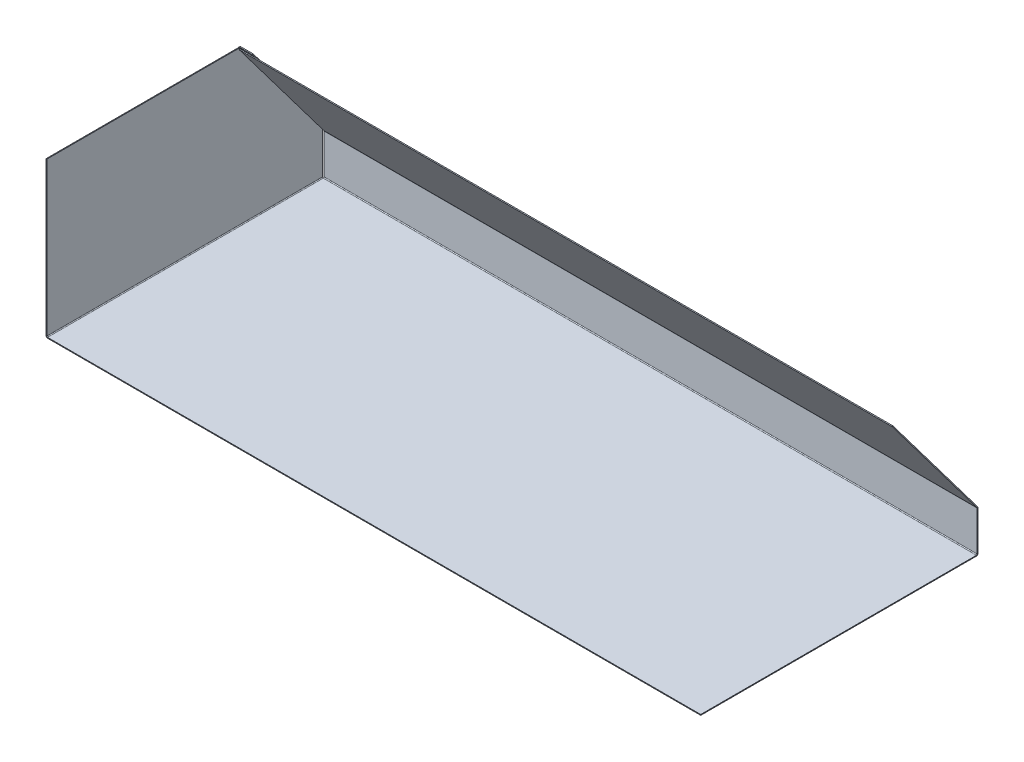
ISO-10303-21;
HEADER;
FILE_DESCRIPTION(('STEP AP214'),'2;1');
FILE_NAME('part.step','',(''),(''),'','','');
FILE_SCHEMA(('AUTOMOTIVE_DESIGN { 1 0 10303 214 1 1 1 1 }'));
ENDSEC;
DATA;
#1=APPLICATION_CONTEXT('core data for automotive mechanical design processes');
#2=APPLICATION_PROTOCOL_DEFINITION('international standard','automotive_design',2000,#1);
#3=PRODUCT_CONTEXT('',#1,'mechanical');
#4=PRODUCT('Part','Part','',(#3));
#5=PRODUCT_RELATED_PRODUCT_CATEGORY('part','',(#4));
#6=PRODUCT_DEFINITION_FORMATION('','',#4);
#7=PRODUCT_DEFINITION_CONTEXT('part definition',#1,'design');
#8=PRODUCT_DEFINITION('design','',#6,#7);
#9=PRODUCT_DEFINITION_SHAPE('','',#8);
#10=(LENGTH_UNIT() NAMED_UNIT(*) SI_UNIT(.MILLI.,.METRE.));
#11=(NAMED_UNIT(*) PLANE_ANGLE_UNIT() SI_UNIT($,.RADIAN.));
#12=(NAMED_UNIT(*) SI_UNIT($,.STERADIAN.) SOLID_ANGLE_UNIT());
#13=UNCERTAINTY_MEASURE_WITH_UNIT(LENGTH_MEASURE(1.E-05),#10,'distance_accuracy_value','');
#14=(GEOMETRIC_REPRESENTATION_CONTEXT(3) GLOBAL_UNCERTAINTY_ASSIGNED_CONTEXT((#13)) GLOBAL_UNIT_ASSIGNED_CONTEXT((#10,
#11,#12)) REPRESENTATION_CONTEXT('',''));
#15=CARTESIAN_POINT('',(0.,0.,0.));
#16=DIRECTION('',(0.,0.,1.));
#17=DIRECTION('',(1.,0.,0.));
#18=AXIS2_PLACEMENT_3D('',#15,#16,#17);
#19=CARTESIAN_POINT('',(-1.4732,0.,-253.2634));
#20=DIRECTION('',(0.,0.,1.));
#21=DIRECTION('',(1.,0.,0.));
#22=AXIS2_PLACEMENT_3D('',#19,#20,#21);
#23=PLANE('',#22);
#24=DIRECTION('',(-1.,0.,0.));
#25=VECTOR('',#24,1.);
#26=CARTESIAN_POINT('',(-1.47320000000014,39.5648653435567,-253.2634));
#27=LINE('',#26,#25);
#28=CARTESIAN_POINT('',(-1.47320000000014,39.5648653435567,-253.2634));
#29=VERTEX_POINT('',#28);
#30=CARTESIAN_POINT('',(-0.736600000000136,39.5648653435567,-253.2634));
#31=VERTEX_POINT('',#30);
#32=EDGE_CURVE('E286',#29,#31,#27,.F.);
#33=ORIENTED_EDGE('',*,*,#32,.T.);
#34=DIRECTION('',(0.,1.,0.));
#35=VECTOR('',#34,1.);
#36=CARTESIAN_POINT('',(-0.736599999999997,0.,-253.2634));
#37=LINE('',#36,#35);
#38=CARTESIAN_POINT('',(-0.7366,0.736599999999995,-253.2634));
#39=VERTEX_POINT('',#38);
#40=EDGE_CURVE('E301',#31,#39,#37,.F.);
#41=ORIENTED_EDGE('',*,*,#40,.T.);
#42=DIRECTION('',(1.,0.,0.));
#43=VECTOR('',#42,1.);
#44=CARTESIAN_POINT('',(-1.4732,0.73659999999999,-253.2634));
#45=LINE('',#44,#43);
#46=CARTESIAN_POINT('',(-1.4732,0.736599999999992,-253.2634));
#47=VERTEX_POINT('',#46);
#48=EDGE_CURVE('E288',#39,#47,#45,.F.);
#49=ORIENTED_EDGE('',*,*,#48,.T.);
#50=DIRECTION('',(0.,-1.,0.));
#51=VECTOR('',#50,1.);
#52=CARTESIAN_POINT('',(-1.4732,0.,-253.2634));
#53=LINE('',#52,#51);
#54=EDGE_CURVE('E295',#29,#47,#53,.T.);
#55=ORIENTED_EDGE('',*,*,#54,.F.);
#56=EDGE_LOOP('',(#33,#41,#49,#55));
#57=FACE_BOUND('',#56,.T.);
#58=ADVANCED_FACE('F81',(#57),#23,.F.);
#59=CARTESIAN_POINT('',(-1.4732,0.,0.));
#60=DIRECTION('',(1.,0.,0.));
#61=DIRECTION('',(0.,1.,0.));
#62=AXIS2_PLACEMENT_3D('',#59,#60,#61);
#63=PLANE('',#62);
#64=DIRECTION('',(0.,0.798635510047298,0.601815023152041));
#65=VECTOR('',#64,1.);
#66=CARTESIAN_POINT('',(-1.47320000000013,38.0035309797624,-254.439949833402));
#67=LINE('',#66,#65);
#68=CARTESIAN_POINT('',(-1.47320000000052,141.432479218494,-176.500646990235));
#69=VERTEX_POINT('',#68);
#70=EDGE_CURVE('E271',#29,#69,#67,.T.);
#71=ORIENTED_EDGE('',*,*,#70,.F.);
#72=ORIENTED_EDGE('',*,*,#54,.T.);
#73=DIRECTION('',(0.,0.,1.));
#74=VECTOR('',#73,1.);
#75=CARTESIAN_POINT('',(-1.4732,0.73659999999999,-253.2634));
#76=LINE('',#75,#74);
#77=CARTESIAN_POINT('',(-1.4732,0.736599999999995,0.));
#78=VERTEX_POINT('',#77);
#79=EDGE_CURVE('E308',#78,#47,#76,.F.);
#80=ORIENTED_EDGE('',*,*,#79,.F.);
#81=DIRECTION('',(0.,1.,0.));
#82=VECTOR('',#81,1.);
#83=CARTESIAN_POINT('',(-1.4732,0.,0.));
#84=LINE('',#83,#82);
#85=CARTESIAN_POINT('',(-1.47320000000049,141.432479218494,0.));
#86=VERTEX_POINT('',#85);
#87=EDGE_CURVE('E299',#78,#86,#84,.T.);
#88=ORIENTED_EDGE('',*,*,#87,.T.);
#89=DIRECTION('',(0.,0.,-1.));
#90=VECTOR('',#89,1.);
#91=CARTESIAN_POINT('',(-1.47320000000049,141.432479218494,0.));
#92=LINE('',#91,#90);
#93=EDGE_CURVE('E297',#86,#69,#92,.T.);
#94=ORIENTED_EDGE('',*,*,#93,.T.);
#95=EDGE_LOOP('',(#71,#72,#80,#88,#94));
#96=FACE_BOUND('',#95,.T.);
#97=ADVANCED_FACE('F461',(#96),#63,.F.);
#98=CARTESIAN_POINT('',(-0.736599999999997,0.,0.));
#99=DIRECTION('',(1.,0.,0.));
#100=DIRECTION('',(0.,1.,0.));
#101=AXIS2_PLACEMENT_3D('',#98,#99,#100);
#102=PLANE('',#101);
#103=ORIENTED_EDGE('',*,*,#40,.F.);
#104=DIRECTION('',(0.,0.798635510047298,0.601815023152041));
#105=VECTOR('',#104,1.);
#106=CARTESIAN_POINT('',(-0.73660000000013,38.0035309797624,-254.439949833402));
#107=LINE('',#106,#105);
#108=CARTESIAN_POINT('',(-0.736600000000491,141.432479218494,-176.500646990235));
#109=VERTEX_POINT('',#108);
#110=EDGE_CURVE('E281',#31,#109,#107,.T.);
#111=ORIENTED_EDGE('',*,*,#110,.T.);
#112=DIRECTION('',(0.,0.,1.));
#113=VECTOR('',#112,1.);
#114=CARTESIAN_POINT('',(-0.736600000000491,141.432479218494,-253.2634));
#115=LINE('',#114,#113);
#116=CARTESIAN_POINT('',(-0.736600000000491,141.432479218494,0.));
#117=VERTEX_POINT('',#116);
#118=EDGE_CURVE('E303',#117,#109,#115,.F.);
#119=ORIENTED_EDGE('',*,*,#118,.F.);
#120=DIRECTION('',(0.,-1.,0.));
#121=VECTOR('',#120,1.);
#122=CARTESIAN_POINT('',(-0.736600000000491,141.432479218494,0.));
#123=LINE('',#122,#121);
#124=CARTESIAN_POINT('',(-0.736599999999981,0.736599999999995,0.));
#125=VERTEX_POINT('',#124);
#126=EDGE_CURVE('E306',#125,#117,#123,.F.);
#127=ORIENTED_EDGE('',*,*,#126,.F.);
#128=DIRECTION('',(0.,0.,1.));
#129=VECTOR('',#128,1.);
#130=CARTESIAN_POINT('',(-0.7366,0.736599999999992,-253.2634));
#131=LINE('',#130,#129);
#132=EDGE_CURVE('E314',#39,#125,#131,.T.);
#133=ORIENTED_EDGE('',*,*,#132,.F.);
#134=EDGE_LOOP('',(#103,#111,#119,#127,#133));
#135=FACE_BOUND('',#134,.T.);
#136=ADVANCED_FACE('F452',(#135),#102,.T.);
#137=CARTESIAN_POINT('',(-1.47320000000049,141.432479218494,-253.2634));
#138=DIRECTION('',(0.,-1.,0.));
#139=DIRECTION('',(1.,0.,0.));
#140=AXIS2_PLACEMENT_3D('',#137,#138,#139);
#141=PLANE('',#140);
#142=DIRECTION('',(-1.,0.,0.));
#143=VECTOR('',#142,1.);
#144=CARTESIAN_POINT('',(-1.47320000000049,141.432479218494,-176.500646990235));
#145=LINE('',#144,#143);
#146=EDGE_CURVE('E283',#69,#109,#145,.F.);
#147=ORIENTED_EDGE('',*,*,#146,.F.);
#148=ORIENTED_EDGE('',*,*,#93,.F.);
#149=DIRECTION('',(1.,0.,0.));
#150=VECTOR('',#149,1.);
#151=CARTESIAN_POINT('',(-1.47320000000049,141.432479218494,0.));
#152=LINE('',#151,#150);
#153=EDGE_CURVE('E291',#86,#117,#152,.T.);
#154=ORIENTED_EDGE('',*,*,#153,.T.);
#155=ORIENTED_EDGE('',*,*,#118,.T.);
#156=EDGE_LOOP('',(#147,#148,#154,#155));
#157=FACE_BOUND('',#156,.T.);
#158=ADVANCED_FACE('F493',(#157),#141,.F.);
#159=CARTESIAN_POINT('',(0.,37.3634,-254.7366));
#160=DIRECTION('',(1.,0.,0.));
#161=DIRECTION('',(0.,0.,-1.));
#162=AXIS2_PLACEMENT_3D('',#159,#160,#161);
#163=PLANE('',#162);
#164=DIRECTION('',(0.,0.,-1.));
#165=VECTOR('',#164,1.);
#166=CARTESIAN_POINT('',(0.,37.1169370876548,-254.));
#167=LINE('',#166,#165);
#168=CARTESIAN_POINT('',(0.,37.1169370876548,-254.));
#169=VERTEX_POINT('',#168);
#170=CARTESIAN_POINT('',(0.,37.1169370876548,-254.7366));
#171=VERTEX_POINT('',#170);
#172=EDGE_CURVE('E366',#169,#171,#167,.T.);
#173=ORIENTED_EDGE('',*,*,#172,.T.);
#174=DIRECTION('',(0.,1.,0.));
#175=VECTOR('',#174,1.);
#176=CARTESIAN_POINT('',(0.,37.3634,-254.7366));
#177=LINE('',#176,#175);
#178=CARTESIAN_POINT('',(0.,0.736599999999981,-254.7366));
#179=VERTEX_POINT('',#178);
#180=EDGE_CURVE('E392',#179,#171,#177,.T.);
#181=ORIENTED_EDGE('',*,*,#180,.F.);
#182=DIRECTION('',(0.,0.,-1.));
#183=VECTOR('',#182,1.);
#184=CARTESIAN_POINT('',(0.,0.736599999999976,-254.));
#185=LINE('',#184,#183);
#186=CARTESIAN_POINT('',(0.,0.736599999999969,-254.));
#187=VERTEX_POINT('',#186);
#188=EDGE_CURVE('E383',#187,#179,#185,.T.);
#189=ORIENTED_EDGE('',*,*,#188,.F.);
#190=DIRECTION('',(0.,1.,0.));
#191=VECTOR('',#190,1.);
#192=CARTESIAN_POINT('',(0.,37.3634,-254.));
#193=LINE('',#192,#191);
#194=EDGE_CURVE('E391',#187,#169,#193,.T.);
#195=ORIENTED_EDGE('',*,*,#194,.T.);
#196=EDGE_LOOP('',(#173,#181,#189,#195));
#197=FACE_BOUND('',#196,.T.);
#198=ADVANCED_FACE('F495',(#197),#163,.F.);
#199=CARTESIAN_POINT('',(600.,0.,-254.7366));
#200=DIRECTION('',(-1.,0.,0.));
#201=DIRECTION('',(0.,0.,1.));
#202=AXIS2_PLACEMENT_3D('',#199,#200,#201);
#203=PLANE('',#202);
#204=DIRECTION('',(0.,0.,-1.));
#205=VECTOR('',#204,1.);
#206=CARTESIAN_POINT('',(600.,37.1169370876548,-254.));
#207=LINE('',#206,#205);
#208=CARTESIAN_POINT('',(600.,37.1169370876548,-254.));
#209=VERTEX_POINT('',#208);
#210=CARTESIAN_POINT('',(600.,37.1169370876548,-254.7366));
#211=VERTEX_POINT('',#210);
#212=EDGE_CURVE('E375',#209,#211,#207,.T.);
#213=ORIENTED_EDGE('',*,*,#212,.F.);
#214=DIRECTION('',(0.,-1.,0.));
#215=VECTOR('',#214,1.);
#216=CARTESIAN_POINT('',(600.,0.,-254.));
#217=LINE('',#216,#215);
#218=CARTESIAN_POINT('',(600.,0.736599999999969,-254.));
#219=VERTEX_POINT('',#218);
#220=EDGE_CURVE('E395',#209,#219,#217,.T.);
#221=ORIENTED_EDGE('',*,*,#220,.T.);
#222=DIRECTION('',(0.,0.,-1.));
#223=VECTOR('',#222,1.);
#224=CARTESIAN_POINT('',(600.,0.736599999999976,-254.));
#225=LINE('',#224,#223);
#226=CARTESIAN_POINT('',(600.,0.736599999999967,-254.7366));
#227=VERTEX_POINT('',#226);
#228=EDGE_CURVE('E378',#219,#227,#225,.T.);
#229=ORIENTED_EDGE('',*,*,#228,.T.);
#230=DIRECTION('',(0.,-1.,0.));
#231=VECTOR('',#230,1.);
#232=CARTESIAN_POINT('',(600.,0.,-254.7366));
#233=LINE('',#232,#231);
#234=EDGE_CURVE('E394',#211,#227,#233,.T.);
#235=ORIENTED_EDGE('',*,*,#234,.F.);
#236=EDGE_LOOP('',(#213,#221,#229,#235));
#237=FACE_BOUND('',#236,.T.);
#238=ADVANCED_FACE('F501',(#237),#203,.F.);
#239=CARTESIAN_POINT('',(0.,-7.57312154607051E-13,-254.7366));
#240=DIRECTION('',(0.,0.,1.));
#241=DIRECTION('',(0.,-1.,0.));
#242=AXIS2_PLACEMENT_3D('',#239,#240,#241);
#243=PLANE('',#242);
#244=DIRECTION('',(-1.,0.,0.));
#245=VECTOR('',#244,1.);
#246=CARTESIAN_POINT('',(0.,37.1169370876548,-254.7366));
#247=LINE('',#246,#245);
#248=EDGE_CURVE('E360',#171,#211,#247,.F.);
#249=ORIENTED_EDGE('',*,*,#248,.T.);
#250=ORIENTED_EDGE('',*,*,#234,.T.);
#251=DIRECTION('',(1.,0.,0.));
#252=VECTOR('',#251,1.);
#253=CARTESIAN_POINT('',(0.,0.736599999999981,-254.7366));
#254=LINE('',#253,#252);
#255=EDGE_CURVE('E386',#179,#227,#254,.T.);
#256=ORIENTED_EDGE('',*,*,#255,.F.);
#257=ORIENTED_EDGE('',*,*,#180,.T.);
#258=EDGE_LOOP('',(#249,#250,#256,#257));
#259=FACE_BOUND('',#258,.T.);
#260=ADVANCED_FACE('F778',(#259),#243,.F.);
#261=CARTESIAN_POINT('',(0.,-7.5474032945286E-13,-254.));
#262=DIRECTION('',(0.,0.,1.));
#263=DIRECTION('',(0.,-1.,0.));
#264=AXIS2_PLACEMENT_3D('',#261,#262,#263);
#265=PLANE('',#264);
#266=ORIENTED_EDGE('',*,*,#220,.F.);
#267=DIRECTION('',(-1.,0.,0.));
#268=VECTOR('',#267,1.);
#269=CARTESIAN_POINT('',(0.,37.1169370876548,-254.));
#270=LINE('',#269,#268);
#271=EDGE_CURVE('E96',#169,#209,#270,.F.);
#272=ORIENTED_EDGE('',*,*,#271,.F.);
#273=ORIENTED_EDGE('',*,*,#194,.F.);
#274=DIRECTION('',(-1.,0.,0.));
#275=VECTOR('',#274,1.);
#276=CARTESIAN_POINT('',(600.,0.736599999999976,-254.));
#277=LINE('',#276,#275);
#278=EDGE_CURVE('E381',#219,#187,#277,.T.);
#279=ORIENTED_EDGE('',*,*,#278,.F.);
#280=EDGE_LOOP('',(#266,#272,#273,#279));
#281=FACE_BOUND('',#280,.T.);
#282=ADVANCED_FACE('F788',(#281),#265,.T.);
#283=CARTESIAN_POINT('',(600.,-0.7366,0.));
#284=DIRECTION('',(0.,1.,0.));
#285=DIRECTION('',(0.,0.,1.));
#286=AXIS2_PLACEMENT_3D('',#283,#284,#285);
#287=PLANE('',#286);
#288=DIRECTION('',(-1.,0.,0.));
#289=VECTOR('',#288,1.);
#290=CARTESIAN_POINT('',(0.,-0.736600000000005,-253.2634));
#291=LINE('',#290,#289);
#292=CARTESIAN_POINT('',(0.,-0.736600000000005,-253.2634));
#293=VERTEX_POINT('',#292);
#294=CARTESIAN_POINT('',(600.,-0.7366,-253.2634));
#295=VERTEX_POINT('',#294);
#296=EDGE_CURVE('E400',#293,#295,#291,.F.);
#297=ORIENTED_EDGE('',*,*,#296,.T.);
#298=DIRECTION('',(0.,0.,-1.));
#299=VECTOR('',#298,1.);
#300=CARTESIAN_POINT('',(600.,-0.7366,0.));
#301=LINE('',#300,#299);
#302=CARTESIAN_POINT('',(600.,-0.7366,0.));
#303=VERTEX_POINT('',#302);
#304=EDGE_CURVE('E423',#303,#295,#301,.T.);
#305=ORIENTED_EDGE('',*,*,#304,.F.);
#306=DIRECTION('',(-1.,0.,0.));
#307=VECTOR('',#306,1.);
#308=CARTESIAN_POINT('',(600.,-0.7366,0.));
#309=LINE('',#308,#307);
#310=CARTESIAN_POINT('',(0.,-0.736599999999993,0.));
#311=VERTEX_POINT('',#310);
#312=EDGE_CURVE('E89',#303,#311,#309,.T.);
#313=ORIENTED_EDGE('',*,*,#312,.T.);
#314=DIRECTION('',(0.,0.,-1.));
#315=VECTOR('',#314,1.);
#316=CARTESIAN_POINT('',(0.,-0.7366,0.));
#317=LINE('',#316,#315);
#318=EDGE_CURVE('E420',#311,#293,#317,.T.);
#319=ORIENTED_EDGE('',*,*,#318,.T.);
#320=EDGE_LOOP('',(#297,#305,#313,#319));
#321=FACE_BOUND('',#320,.T.);
#322=ADVANCED_FACE('F83',(#321),#287,.F.);
#323=CARTESIAN_POINT('',(600.,0.,0.));
#324=DIRECTION('',(0.,1.,0.));
#325=DIRECTION('',(0.,0.,1.));
#326=AXIS2_PLACEMENT_3D('',#323,#324,#325);
#327=PLANE('',#326);
#328=DIRECTION('',(0.,0.,-1.));
#329=VECTOR('',#328,1.);
#330=CARTESIAN_POINT('',(600.,0.,0.));
#331=LINE('',#330,#329);
#332=CARTESIAN_POINT('',(600.,0.,0.));
#333=VERTEX_POINT('',#332);
#334=CARTESIAN_POINT('',(600.,0.,-253.2634));
#335=VERTEX_POINT('',#334);
#336=EDGE_CURVE('E426',#333,#335,#331,.T.);
#337=ORIENTED_EDGE('',*,*,#336,.T.);
#338=DIRECTION('',(-1.,0.,0.));
#339=VECTOR('',#338,1.);
#340=CARTESIAN_POINT('',(0.,0.,-253.2634));
#341=LINE('',#340,#339);
#342=CARTESIAN_POINT('',(0.,0.,-253.2634));
#343=VERTEX_POINT('',#342);
#344=EDGE_CURVE('E412',#343,#335,#341,.F.);
#345=ORIENTED_EDGE('',*,*,#344,.F.);
#346=DIRECTION('',(0.,0.,-1.));
#347=VECTOR('',#346,1.);
#348=CARTESIAN_POINT('',(0.,0.,0.));
#349=LINE('',#348,#347);
#350=CARTESIAN_POINT('',(0.,0.,0.));
#351=VERTEX_POINT('',#350);
#352=EDGE_CURVE('E434',#351,#343,#349,.T.);
#353=ORIENTED_EDGE('',*,*,#352,.F.);
#354=DIRECTION('',(-1.,0.,0.));
#355=VECTOR('',#354,1.);
#356=CARTESIAN_POINT('',(600.,0.,0.));
#357=LINE('',#356,#355);
#358=EDGE_CURVE('E13',#333,#351,#357,.T.);
#359=ORIENTED_EDGE('',*,*,#358,.F.);
#360=EDGE_LOOP('',(#337,#345,#353,#359));
#361=FACE_BOUND('',#360,.T.);
#362=ADVANCED_FACE('F849',(#361),#327,.T.);
#363=CARTESIAN_POINT('',(600.,0.,0.));
#364=DIRECTION('',(-1.,0.,0.));
#365=DIRECTION('',(0.,0.,1.));
#366=AXIS2_PLACEMENT_3D('',#363,#364,#365);
#367=PLANE('',#366);
#368=DIRECTION('',(0.,-1.,0.));
#369=VECTOR('',#368,1.);
#370=CARTESIAN_POINT('',(600.,0.,-253.2634));
#371=LINE('',#370,#369);
#372=EDGE_CURVE('E417',#335,#295,#371,.T.);
#373=ORIENTED_EDGE('',*,*,#372,.F.);
#374=ORIENTED_EDGE('',*,*,#336,.F.);
#375=DIRECTION('',(0.,1.,0.));
#376=VECTOR('',#375,1.);
#377=CARTESIAN_POINT('',(600.,-0.7366,0.));
#378=LINE('',#377,#376);
#379=EDGE_CURVE('E430',#303,#333,#378,.T.);
#380=ORIENTED_EDGE('',*,*,#379,.F.);
#381=ORIENTED_EDGE('',*,*,#304,.T.);
#382=EDGE_LOOP('',(#373,#374,#380,#381));
#383=FACE_BOUND('',#382,.T.);
#384=ADVANCED_FACE('F856',(#383),#367,.F.);
#385=CARTESIAN_POINT('',(600.,-0.7366,0.));
#386=DIRECTION('',(0.,0.,1.));
#387=DIRECTION('',(1.,0.,0.));
#388=AXIS2_PLACEMENT_3D('',#385,#386,#387);
#389=PLANE('',#388);
#390=DIRECTION('',(0.,1.,0.));
#391=VECTOR('',#390,1.);
#392=CARTESIAN_POINT('',(0.,-0.7366,0.));
#393=LINE('',#392,#391);
#394=EDGE_CURVE('E427',#311,#351,#393,.T.);
#395=ORIENTED_EDGE('',*,*,#394,.F.);
#396=ORIENTED_EDGE('',*,*,#312,.F.);
#397=ORIENTED_EDGE('',*,*,#379,.T.);
#398=ORIENTED_EDGE('',*,*,#358,.T.);
#399=EDGE_LOOP('',(#395,#396,#397,#398));
#400=FACE_BOUND('',#399,.T.);
#401=ADVANCED_FACE('F439',(#400),#389,.T.);
#402=CARTESIAN_POINT('',(600.,0.736599999999971,-253.2634));
#403=DIRECTION('',(1.,0.,0.));
#404=DIRECTION('',(0.,0.,-1.));
#405=AXIS2_PLACEMENT_3D('',#402,#403,#404);
#406=PLANE('',#405);
#407=ORIENTED_EDGE('',*,*,#228,.F.);
#408=CARTESIAN_POINT('',(600.,0.736599999999971,-253.2634));
#409=DIRECTION('',(-1.,0.,0.));
#410=DIRECTION('',(0.,0.,1.));
#411=AXIS2_PLACEMENT_3D('',#408,#409,#410);
#412=CIRCLE('',#411,0.736599999999976);
#413=EDGE_CURVE('E409',#335,#219,#412,.F.);
#414=ORIENTED_EDGE('',*,*,#413,.F.);
#415=ORIENTED_EDGE('',*,*,#372,.T.);
#416=CARTESIAN_POINT('',(600.,0.736599999999971,-253.2634));
#417=DIRECTION('',(-1.,0.,0.));
#418=DIRECTION('',(0.,0.,1.));
#419=AXIS2_PLACEMENT_3D('',#416,#417,#418);
#420=CIRCLE('',#419,1.47319999999998);
#421=EDGE_CURVE('E402',#295,#227,#420,.F.);
#422=ORIENTED_EDGE('',*,*,#421,.T.);
#423=EDGE_LOOP('',(#407,#414,#415,#422));
#424=FACE_BOUND('',#423,.T.);
#425=ADVANCED_FACE('F827',(#424),#406,.T.);
#426=CARTESIAN_POINT('',(0.,0.736599999999971,-253.2634));
#427=DIRECTION('',(1.,0.,0.));
#428=DIRECTION('',(0.,0.,-1.));
#429=AXIS2_PLACEMENT_3D('',#426,#427,#428);
#430=PLANE('',#429);
#431=CARTESIAN_POINT('',(0.,0.736599999999971,-253.2634));
#432=DIRECTION('',(-1.,0.,0.));
#433=DIRECTION('',(0.,0.,1.));
#434=AXIS2_PLACEMENT_3D('',#431,#432,#433);
#435=CIRCLE('',#434,0.736599999999976);
#436=EDGE_CURVE('E397',#187,#343,#435,.T.);
#437=ORIENTED_EDGE('',*,*,#436,.F.);
#438=ORIENTED_EDGE('',*,*,#188,.T.);
#439=CARTESIAN_POINT('',(0.,0.736599999999971,-253.2634));
#440=DIRECTION('',(-1.,0.,0.));
#441=DIRECTION('',(0.,0.,1.));
#442=AXIS2_PLACEMENT_3D('',#439,#440,#441);
#443=CIRCLE('',#442,1.47319999999998);
#444=EDGE_CURVE('E403',#179,#293,#443,.T.);
#445=ORIENTED_EDGE('',*,*,#444,.T.);
#446=DIRECTION('',(0.,-1.,0.));
#447=VECTOR('',#446,1.);
#448=CARTESIAN_POINT('',(0.,0.,-253.2634));
#449=LINE('',#448,#447);
#450=EDGE_CURVE('E406',#343,#293,#449,.T.);
#451=ORIENTED_EDGE('',*,*,#450,.F.);
#452=EDGE_LOOP('',(#437,#438,#445,#451));
#453=FACE_BOUND('',#452,.T.);
#454=ADVANCED_FACE('F816',(#453),#430,.F.);
#455=CARTESIAN_POINT('',(0.,0.736599999999971,-253.2634));
#456=DIRECTION('',(-1.,0.,0.));
#457=DIRECTION('',(0.,0.,-1.));
#458=AXIS2_PLACEMENT_3D('',#455,#456,#457);
#459=CYLINDRICAL_SURFACE('',#458,1.47319999999998);
#460=ORIENTED_EDGE('',*,*,#296,.F.);
#461=ORIENTED_EDGE('',*,*,#444,.F.);
#462=ORIENTED_EDGE('',*,*,#255,.T.);
#463=ORIENTED_EDGE('',*,*,#421,.F.);
#464=EDGE_LOOP('',(#460,#461,#462,#463));
#465=FACE_BOUND('',#464,.T.);
#466=ADVANCED_FACE('F805',(#465),#459,.T.);
#467=CARTESIAN_POINT('',(0.,0.736599999999971,-253.2634));
#468=DIRECTION('',(-1.,0.,0.));
#469=DIRECTION('',(0.,0.,-1.));
#470=AXIS2_PLACEMENT_3D('',#467,#468,#469);
#471=CYLINDRICAL_SURFACE('',#470,0.736599999999976);
#472=ORIENTED_EDGE('',*,*,#344,.T.);
#473=ORIENTED_EDGE('',*,*,#413,.T.);
#474=ORIENTED_EDGE('',*,*,#278,.T.);
#475=ORIENTED_EDGE('',*,*,#436,.T.);
#476=EDGE_LOOP('',(#472,#473,#474,#475));
#477=FACE_BOUND('',#476,.T.);
#478=ADVANCED_FACE('F761',(#477),#471,.F.);
#479=CARTESIAN_POINT('',(600.,37.1169370876548,-253.2634));
#480=DIRECTION('',(1.,0.,0.));
#481=DIRECTION('',(0.,0.,-1.));
#482=AXIS2_PLACEMENT_3D('',#479,#480,#481);
#483=PLANE('',#482);
#484=DIRECTION('',(0.,0.601815023152041,-0.798635510047298));
#485=VECTOR('',#484,1.);
#486=CARTESIAN_POINT('',(600.,37.5602340337086,-253.851674916701));
#487=LINE('',#486,#485);
#488=CARTESIAN_POINT('',(600.,37.5602340337086,-253.851674916701));
#489=VERTEX_POINT('',#488);
#490=CARTESIAN_POINT('',(600.,38.0035309797624,-254.439949833402));
#491=VERTEX_POINT('',#490);
#492=EDGE_CURVE('E321',#489,#491,#487,.T.);
#493=ORIENTED_EDGE('',*,*,#492,.F.);
#494=CARTESIAN_POINT('',(600.,37.1169370876548,-253.2634));
#495=DIRECTION('',(-1.,0.,0.));
#496=DIRECTION('',(0.,0.,1.));
#497=AXIS2_PLACEMENT_3D('',#494,#495,#496);
#498=CIRCLE('',#497,0.736599999999989);
#499=EDGE_CURVE('E369',#209,#489,#498,.F.);
#500=ORIENTED_EDGE('',*,*,#499,.F.);
#501=ORIENTED_EDGE('',*,*,#212,.T.);
#502=CARTESIAN_POINT('',(600.,37.1169370876548,-253.2634));
#503=DIRECTION('',(-1.,0.,0.));
#504=DIRECTION('',(0.,0.,1.));
#505=AXIS2_PLACEMENT_3D('',#502,#503,#504);
#506=CIRCLE('',#505,1.47319999999999);
#507=EDGE_CURVE('E362',#211,#491,#506,.F.);
#508=ORIENTED_EDGE('',*,*,#507,.T.);
#509=EDGE_LOOP('',(#493,#500,#501,#508));
#510=FACE_BOUND('',#509,.T.);
#511=ADVANCED_FACE('F750',(#510),#483,.T.);
#512=CARTESIAN_POINT('',(0.,37.1169370876548,-253.2634));
#513=DIRECTION('',(1.,0.,0.));
#514=DIRECTION('',(0.,0.,-1.));
#515=AXIS2_PLACEMENT_3D('',#512,#513,#514);
#516=PLANE('',#515);
#517=CARTESIAN_POINT('',(0.,37.1169370876548,-253.2634));
#518=DIRECTION('',(-1.,0.,0.));
#519=DIRECTION('',(0.,0.,1.));
#520=AXIS2_PLACEMENT_3D('',#517,#518,#519);
#521=CIRCLE('',#520,0.736599999999989);
#522=CARTESIAN_POINT('',(0.,37.5602340337086,-253.851674916701));
#523=VERTEX_POINT('',#522);
#524=EDGE_CURVE('E359',#523,#169,#521,.T.);
#525=ORIENTED_EDGE('',*,*,#524,.F.);
#526=DIRECTION('',(0.,0.601815023152041,-0.798635510047298));
#527=VECTOR('',#526,1.);
#528=CARTESIAN_POINT('',(0.,37.5602340337086,-253.851674916701));
#529=LINE('',#528,#527);
#530=CARTESIAN_POINT('',(0.,38.0035309797624,-254.439949833402));
#531=VERTEX_POINT('',#530);
#532=EDGE_CURVE('E332',#523,#531,#529,.T.);
#533=ORIENTED_EDGE('',*,*,#532,.T.);
#534=CARTESIAN_POINT('',(0.,37.1169370876548,-253.2634));
#535=DIRECTION('',(-1.,0.,0.));
#536=DIRECTION('',(0.,0.,1.));
#537=AXIS2_PLACEMENT_3D('',#534,#535,#536);
#538=CIRCLE('',#537,1.47319999999999);
#539=EDGE_CURVE('E363',#531,#171,#538,.T.);
#540=ORIENTED_EDGE('',*,*,#539,.T.);
#541=ORIENTED_EDGE('',*,*,#172,.F.);
#542=EDGE_LOOP('',(#525,#533,#540,#541));
#543=FACE_BOUND('',#542,.T.);
#544=ADVANCED_FACE('F739',(#543),#516,.F.);
#545=CARTESIAN_POINT('',(0.,37.1169370876548,-253.2634));
#546=DIRECTION('',(-1.,0.,0.));
#547=DIRECTION('',(0.,0.601815023152041,-0.798635510047298));
#548=AXIS2_PLACEMENT_3D('',#545,#546,#547);
#549=CYLINDRICAL_SURFACE('',#548,1.47319999999999);
#550=ORIENTED_EDGE('',*,*,#248,.F.);
#551=ORIENTED_EDGE('',*,*,#539,.F.);
#552=DIRECTION('',(1.,0.,0.));
#553=VECTOR('',#552,1.);
#554=CARTESIAN_POINT('',(0.,38.0035309797624,-254.439949833402));
#555=LINE('',#554,#553);
#556=EDGE_CURVE('E335',#531,#491,#555,.T.);
#557=ORIENTED_EDGE('',*,*,#556,.T.);
#558=ORIENTED_EDGE('',*,*,#507,.F.);
#559=EDGE_LOOP('',(#550,#551,#557,#558));
#560=FACE_BOUND('',#559,.T.);
#561=ADVANCED_FACE('F728',(#560),#549,.T.);
#562=CARTESIAN_POINT('',(0.,37.1169370876548,-253.2634));
#563=DIRECTION('',(-1.,0.,0.));
#564=DIRECTION('',(0.,0.601815023152041,-0.798635510047298));
#565=AXIS2_PLACEMENT_3D('',#562,#563,#564);
#566=CYLINDRICAL_SURFACE('',#565,0.736599999999989);
#567=ORIENTED_EDGE('',*,*,#271,.T.);
#568=ORIENTED_EDGE('',*,*,#499,.T.);
#569=DIRECTION('',(-1.,0.,0.));
#570=VECTOR('',#569,1.);
#571=CARTESIAN_POINT('',(600.,37.5602340337086,-253.851674916701));
#572=LINE('',#571,#570);
#573=EDGE_CURVE('E330',#489,#523,#572,.T.);
#574=ORIENTED_EDGE('',*,*,#573,.T.);
#575=ORIENTED_EDGE('',*,*,#524,.T.);
#576=EDGE_LOOP('',(#567,#568,#574,#575));
#577=FACE_BOUND('',#576,.T.);
#578=ADVANCED_FACE('F717',(#577),#566,.F.);
#579=CARTESIAN_POINT('',(0.,141.432479218494,-176.500646990235));
#580=DIRECTION('',(1.,0.,0.));
#581=DIRECTION('',(0.,0.,-1.));
#582=AXIS2_PLACEMENT_3D('',#579,#580,#581);
#583=PLANE('',#582);
#584=ORIENTED_EDGE('',*,*,#532,.F.);
#585=DIRECTION('',(0.,0.798635510047298,0.601815023152041));
#586=VECTOR('',#585,1.);
#587=CARTESIAN_POINT('',(0.,140.98918227244,-175.912372073534));
#588=LINE('',#587,#586);
#589=CARTESIAN_POINT('',(0.,140.98918227244,-175.912372073534));
#590=VERTEX_POINT('',#589);
#591=EDGE_CURVE('E339',#523,#590,#588,.T.);
#592=ORIENTED_EDGE('',*,*,#591,.T.);
#593=DIRECTION('',(0.,-0.601815023152042,0.798635510047298));
#594=VECTOR('',#593,1.);
#595=CARTESIAN_POINT('',(0.,141.432479218494,-176.500646990235));
#596=LINE('',#595,#594);
#597=CARTESIAN_POINT('',(0.,141.432479218494,-176.500646990235));
#598=VERTEX_POINT('',#597);
#599=EDGE_CURVE('E356',#598,#590,#596,.T.);
#600=ORIENTED_EDGE('',*,*,#599,.F.);
#601=DIRECTION('',(0.,0.798635510047298,0.601815023152041));
#602=VECTOR('',#601,1.);
#603=CARTESIAN_POINT('',(0.,141.432479218494,-176.500646990235));
#604=LINE('',#603,#602);
#605=EDGE_CURVE('E340',#531,#598,#604,.T.);
#606=ORIENTED_EDGE('',*,*,#605,.F.);
#607=EDGE_LOOP('',(#584,#592,#600,#606));
#608=FACE_BOUND('',#607,.T.);
#609=ADVANCED_FACE('F706',(#608),#583,.F.);
#610=CARTESIAN_POINT('',(600.,37.8066969460538,-254.588274916701));
#611=DIRECTION('',(-1.,0.,0.));
#612=DIRECTION('',(0.,0.,1.));
#613=AXIS2_PLACEMENT_3D('',#610,#611,#612);
#614=PLANE('',#613);
#615=ORIENTED_EDGE('',*,*,#492,.T.);
#616=DIRECTION('',(0.,-0.798635510047298,-0.601815023152041));
#617=VECTOR('',#616,1.);
#618=CARTESIAN_POINT('',(600.,37.8066969460538,-254.588274916701));
#619=LINE('',#618,#617);
#620=CARTESIAN_POINT('',(600.,141.432479218494,-176.500646990235));
#621=VERTEX_POINT('',#620);
#622=EDGE_CURVE('E345',#621,#491,#619,.T.);
#623=ORIENTED_EDGE('',*,*,#622,.F.);
#624=DIRECTION('',(0.,-0.601815023152042,0.798635510047298));
#625=VECTOR('',#624,1.);
#626=CARTESIAN_POINT('',(600.,141.432479218494,-176.500646990235));
#627=LINE('',#626,#625);
#628=CARTESIAN_POINT('',(600.,140.98918227244,-175.912372073534));
#629=VERTEX_POINT('',#628);
#630=EDGE_CURVE('E348',#621,#629,#627,.T.);
#631=ORIENTED_EDGE('',*,*,#630,.T.);
#632=DIRECTION('',(0.,-0.798635510047298,-0.601815023152041));
#633=VECTOR('',#632,1.);
#634=CARTESIAN_POINT('',(600.,37.3634,-254.));
#635=LINE('',#634,#633);
#636=EDGE_CURVE('E343',#629,#489,#635,.T.);
#637=ORIENTED_EDGE('',*,*,#636,.T.);
#638=EDGE_LOOP('',(#615,#623,#631,#637));
#639=FACE_BOUND('',#638,.T.);
#640=ADVANCED_FACE('F695',(#639),#614,.F.);
#641=CARTESIAN_POINT('',(0.,136.055857940053,-180.552221730473));
#642=DIRECTION('',(0.,-0.601815023152041,0.798635510047298));
#643=DIRECTION('',(0.,-0.798635510047298,-0.601815023152041));
#644=AXIS2_PLACEMENT_3D('',#641,#642,#643);
#645=PLANE('',#644);
#646=ORIENTED_EDGE('',*,*,#556,.F.);
#647=ORIENTED_EDGE('',*,*,#605,.T.);
#648=DIRECTION('',(1.,0.,0.));
#649=VECTOR('',#648,1.);
#650=CARTESIAN_POINT('',(600.,141.432479218494,-176.500646990235));
#651=LINE('',#650,#649);
#652=EDGE_CURVE('E342',#598,#621,#651,.T.);
#653=ORIENTED_EDGE('',*,*,#652,.T.);
#654=ORIENTED_EDGE('',*,*,#622,.T.);
#655=EDGE_LOOP('',(#646,#647,#653,#654));
#656=FACE_BOUND('',#655,.T.);
#657=ADVANCED_FACE('F684',(#656),#645,.F.);
#658=CARTESIAN_POINT('',(0.,135.612560993999,-179.963946813772));
#659=DIRECTION('',(0.,-0.601815023152041,0.798635510047298));
#660=DIRECTION('',(0.,-0.798635510047298,-0.601815023152041));
#661=AXIS2_PLACEMENT_3D('',#658,#659,#660);
#662=PLANE('',#661);
#663=ORIENTED_EDGE('',*,*,#591,.F.);
#664=ORIENTED_EDGE('',*,*,#573,.F.);
#665=ORIENTED_EDGE('',*,*,#636,.F.);
#666=DIRECTION('',(1.,0.,0.));
#667=VECTOR('',#666,1.);
#668=CARTESIAN_POINT('',(600.,140.98918227244,-175.912372073534));
#669=LINE('',#668,#667);
#670=EDGE_CURVE('E350',#590,#629,#669,.T.);
#671=ORIENTED_EDGE('',*,*,#670,.F.);
#672=EDGE_LOOP('',(#663,#664,#665,#671));
#673=FACE_BOUND('',#672,.T.);
#674=ADVANCED_FACE('F672',(#673),#662,.T.);
#675=CARTESIAN_POINT('',(600.,141.432479218494,-176.500646990235));
#676=DIRECTION('',(0.,-0.798635510047298,-0.601815023152042));
#677=DIRECTION('',(0.,0.601815023152042,-0.798635510047298));
#678=AXIS2_PLACEMENT_3D('',#675,#676,#677);
#679=PLANE('',#678);
#680=ORIENTED_EDGE('',*,*,#670,.T.);
#681=ORIENTED_EDGE('',*,*,#630,.F.);
#682=ORIENTED_EDGE('',*,*,#652,.F.);
#683=ORIENTED_EDGE('',*,*,#599,.T.);
#684=EDGE_LOOP('',(#680,#681,#682,#683));
#685=FACE_BOUND('',#684,.T.);
#686=ADVANCED_FACE('F661',(#685),#679,.F.);
#687=CARTESIAN_POINT('',(0.,0.736599999999997,-253.2634));
#688=DIRECTION('',(0.,0.,-1.));
#689=DIRECTION('',(-1.,0.,0.));
#690=AXIS2_PLACEMENT_3D('',#687,#688,#689);
#691=PLANE('',#690);
#692=ORIENTED_EDGE('',*,*,#48,.F.);
#693=CARTESIAN_POINT('',(0.,0.736599999999997,-253.2634));
#694=DIRECTION('',(0.,0.,1.));
#695=DIRECTION('',(1.,0.,0.));
#696=AXIS2_PLACEMENT_3D('',#693,#694,#695);
#697=CIRCLE('',#696,0.736599999999991);
#698=EDGE_CURVE('E325',#343,#39,#697,.F.);
#699=ORIENTED_EDGE('',*,*,#698,.F.);
#700=ORIENTED_EDGE('',*,*,#450,.T.);
#701=CARTESIAN_POINT('',(0.,0.736599999999997,-253.2634));
#702=DIRECTION('',(0.,0.,1.));
#703=DIRECTION('',(1.,0.,0.));
#704=AXIS2_PLACEMENT_3D('',#701,#702,#703);
#705=CIRCLE('',#704,1.47319999999999);
#706=EDGE_CURVE('E318',#293,#47,#705,.F.);
#707=ORIENTED_EDGE('',*,*,#706,.T.);
#708=EDGE_LOOP('',(#692,#699,#700,#707));
#709=FACE_BOUND('',#708,.T.);
#710=ADVANCED_FACE('F468',(#709),#691,.T.);
#711=CARTESIAN_POINT('',(0.,0.736599999999997,0.));
#712=DIRECTION('',(0.,0.,-1.));
#713=DIRECTION('',(-1.,0.,0.));
#714=AXIS2_PLACEMENT_3D('',#711,#712,#713);
#715=PLANE('',#714);
#716=CARTESIAN_POINT('',(0.,0.736599999999997,0.));
#717=DIRECTION('',(0.,0.,1.));
#718=DIRECTION('',(1.,0.,0.));
#719=AXIS2_PLACEMENT_3D('',#716,#717,#718);
#720=CIRCLE('',#719,0.736599999999991);
#721=EDGE_CURVE('E294',#125,#351,#720,.T.);
#722=ORIENTED_EDGE('',*,*,#721,.F.);
#723=DIRECTION('',(1.,0.,0.));
#724=VECTOR('',#723,1.);
#725=CARTESIAN_POINT('',(-0.7366,0.736599999999997,0.));
#726=LINE('',#725,#724);
#727=EDGE_CURVE('E311',#125,#78,#726,.F.);
#728=ORIENTED_EDGE('',*,*,#727,.T.);
#729=CARTESIAN_POINT('',(0.,0.736599999999997,0.));
#730=DIRECTION('',(0.,0.,1.));
#731=DIRECTION('',(1.,0.,0.));
#732=AXIS2_PLACEMENT_3D('',#729,#730,#731);
#733=CIRCLE('',#732,1.47319999999999);
#734=EDGE_CURVE('E322',#78,#311,#733,.T.);
#735=ORIENTED_EDGE('',*,*,#734,.T.);
#736=ORIENTED_EDGE('',*,*,#394,.T.);
#737=EDGE_LOOP('',(#722,#728,#735,#736));
#738=FACE_BOUND('',#737,.T.);
#739=ADVANCED_FACE('F443',(#738),#715,.F.);
#740=CARTESIAN_POINT('',(0.,0.736599999999997,0.));
#741=DIRECTION('',(0.,0.,1.));
#742=DIRECTION('',(-1.,0.,0.));
#743=AXIS2_PLACEMENT_3D('',#740,#741,#742);
#744=CYLINDRICAL_SURFACE('',#743,1.47319999999999);
#745=ORIENTED_EDGE('',*,*,#318,.F.);
#746=ORIENTED_EDGE('',*,*,#734,.F.);
#747=ORIENTED_EDGE('',*,*,#79,.T.);
#748=ORIENTED_EDGE('',*,*,#706,.F.);
#749=EDGE_LOOP('',(#745,#746,#747,#748));
#750=FACE_BOUND('',#749,.T.);
#751=ADVANCED_FACE('F465',(#750),#744,.T.);
#752=CARTESIAN_POINT('',(0.,0.736599999999997,0.));
#753=DIRECTION('',(0.,0.,1.));
#754=DIRECTION('',(-1.,0.,0.));
#755=AXIS2_PLACEMENT_3D('',#752,#753,#754);
#756=CYLINDRICAL_SURFACE('',#755,0.736599999999991);
#757=ORIENTED_EDGE('',*,*,#352,.T.);
#758=ORIENTED_EDGE('',*,*,#698,.T.);
#759=ORIENTED_EDGE('',*,*,#132,.T.);
#760=ORIENTED_EDGE('',*,*,#721,.T.);
#761=EDGE_LOOP('',(#757,#758,#759,#760));
#762=FACE_BOUND('',#761,.T.);
#763=ADVANCED_FACE('F446',(#762),#756,.F.);
#764=CARTESIAN_POINT('',(-1.47320000000049,141.432479218494,0.));
#765=DIRECTION('',(0.,0.,-1.));
#766=DIRECTION('',(0.,1.,0.));
#767=AXIS2_PLACEMENT_3D('',#764,#765,#766);
#768=PLANE('',#767);
#769=ORIENTED_EDGE('',*,*,#727,.F.);
#770=ORIENTED_EDGE('',*,*,#126,.T.);
#771=ORIENTED_EDGE('',*,*,#153,.F.);
#772=ORIENTED_EDGE('',*,*,#87,.F.);
#773=EDGE_LOOP('',(#769,#770,#771,#772));
#774=FACE_BOUND('',#773,.T.);
#775=ADVANCED_FACE('F457',(#774),#768,.F.);
#776=CARTESIAN_POINT('',(-1.35697539668624E-13,39.5648653435566,-253.2634));
#777=DIRECTION('',(0.,-0.798635510047299,-0.60181502315204));
#778=DIRECTION('',(0.,0.60181502315204,-0.798635510047299));
#779=AXIS2_PLACEMENT_3D('',#776,#777,#778);
#780=PLANE('',#779);
#781=DIRECTION('',(0.,-0.601815023152042,0.798635510047298));
#782=VECTOR('',#781,1.);
#783=CARTESIAN_POINT('',(-1.44957830461312E-13,40.4514592356642,-254.439949833402));
#784=LINE('',#783,#782);
#785=CARTESIAN_POINT('',(-1.40325641092858E-13,40.0081622896104,-253.851674916701));
#786=VERTEX_POINT('',#785);
#787=CARTESIAN_POINT('',(-1.44953742517092E-13,40.4514592356642,-254.439949833402));
#788=VERTEX_POINT('',#787);
#789=EDGE_CURVE('E251',#786,#788,#784,.F.);
#790=ORIENTED_EDGE('',*,*,#789,.F.);
#791=CARTESIAN_POINT('',(-1.35697539668624E-13,39.5648653435566,-253.2634));
#792=DIRECTION('',(0.,0.798635510047299,0.60181502315204));
#793=DIRECTION('',(0.,-0.60181502315204,0.798635510047299));
#794=AXIS2_PLACEMENT_3D('',#791,#792,#793);
#795=CIRCLE('',#794,0.73660000000005);
#796=EDGE_CURVE('E275',#31,#786,#795,.F.);
#797=ORIENTED_EDGE('',*,*,#796,.F.);
#798=ORIENTED_EDGE('',*,*,#32,.F.);
#799=CARTESIAN_POINT('',(-1.35697539668624E-13,39.5648653435566,-253.2634));
#800=DIRECTION('',(0.,0.798635510047299,0.60181502315204));
#801=DIRECTION('',(0.,-0.60181502315204,0.798635510047299));
#802=AXIS2_PLACEMENT_3D('',#799,#800,#801);
#803=CIRCLE('',#802,1.47320000000005);
#804=EDGE_CURVE('E268',#29,#788,#803,.F.);
#805=ORIENTED_EDGE('',*,*,#804,.T.);
#806=EDGE_LOOP('',(#790,#797,#798,#805));
#807=FACE_BOUND('',#806,.T.);
#808=ADVANCED_FACE('F475',(#807),#780,.T.);
#809=CARTESIAN_POINT('',(-4.68764447056171E-13,141.432479218494,-176.500646990235));
#810=DIRECTION('',(0.,-0.798635510047299,-0.60181502315204));
#811=DIRECTION('',(0.,0.60181502315204,-0.798635510047299));
#812=AXIS2_PLACEMENT_3D('',#809,#810,#811);
#813=PLANE('',#812);
#814=CARTESIAN_POINT('',(-4.68764447056171E-13,141.432479218494,-176.500646990235));
#815=DIRECTION('',(0.,0.798635510047299,0.60181502315204));
#816=DIRECTION('',(0.,-0.60181502315204,0.798635510047299));
#817=AXIS2_PLACEMENT_3D('',#814,#815,#816);
#818=CIRCLE('',#817,0.73660000000005);
#819=CARTESIAN_POINT('',(-4.73392548480405E-13,141.875776164548,-177.088921906936));
#820=VERTEX_POINT('',#819);
#821=EDGE_CURVE('E278',#820,#109,#818,.T.);
#822=ORIENTED_EDGE('',*,*,#821,.F.);
#823=DIRECTION('',(0.,-0.601815023152042,0.798635510047298));
#824=VECTOR('',#823,1.);
#825=CARTESIAN_POINT('',(-4.73392548480404E-13,141.875776164548,-177.088921906936));
#826=LINE('',#825,#824);
#827=CARTESIAN_POINT('',(-4.78020649904638E-13,142.319073110602,-177.677196823636));
#828=VERTEX_POINT('',#827);
#829=EDGE_CURVE('E262',#820,#828,#826,.F.);
#830=ORIENTED_EDGE('',*,*,#829,.T.);
#831=CARTESIAN_POINT('',(-4.68764447056171E-13,141.432479218494,-176.500646990235));
#832=DIRECTION('',(0.,0.798635510047299,0.60181502315204));
#833=DIRECTION('',(0.,-0.60181502315204,0.798635510047299));
#834=AXIS2_PLACEMENT_3D('',#831,#832,#833);
#835=CIRCLE('',#834,1.47320000000005);
#836=EDGE_CURVE('E272',#828,#69,#835,.T.);
#837=ORIENTED_EDGE('',*,*,#836,.T.);
#838=ORIENTED_EDGE('',*,*,#146,.T.);
#839=EDGE_LOOP('',(#822,#830,#837,#838));
#840=FACE_BOUND('',#839,.T.);
#841=ADVANCED_FACE('F490',(#840),#813,.F.);
#842=CARTESIAN_POINT('',(-4.68764447056171E-13,141.432479218494,-176.500646990235));
#843=DIRECTION('',(0.,0.798635510047299,0.60181502315204));
#844=DIRECTION('',(0.,0.60181502315204,-0.798635510047299));
#845=AXIS2_PLACEMENT_3D('',#842,#843,#844);
#846=CYLINDRICAL_SURFACE('',#845,1.47320000000005);
#847=ORIENTED_EDGE('',*,*,#70,.T.);
#848=ORIENTED_EDGE('',*,*,#836,.F.);
#849=DIRECTION('',(0.,0.798635510047298,0.601815023152041));
#850=VECTOR('',#849,1.);
#851=CARTESIAN_POINT('',(-1.44953742517092E-13,40.4514592356643,-254.439949833402));
#852=LINE('',#851,#850);
#853=EDGE_CURVE('E260',#828,#788,#852,.F.);
#854=ORIENTED_EDGE('',*,*,#853,.T.);
#855=ORIENTED_EDGE('',*,*,#804,.F.);
#856=EDGE_LOOP('',(#847,#848,#854,#855));
#857=FACE_BOUND('',#856,.T.);
#858=ADVANCED_FACE('F477',(#857),#846,.T.);
#859=CARTESIAN_POINT('',(-4.68764447056171E-13,141.432479218494,-176.500646990235));
#860=DIRECTION('',(0.,0.798635510047299,0.60181502315204));
#861=DIRECTION('',(0.,0.60181502315204,-0.798635510047299));
#862=AXIS2_PLACEMENT_3D('',#859,#860,#861);
#863=CYLINDRICAL_SURFACE('',#862,0.73660000000005);
#864=ORIENTED_EDGE('',*,*,#110,.F.);
#865=ORIENTED_EDGE('',*,*,#796,.T.);
#866=DIRECTION('',(0.,0.798635510047298,0.601815023152041));
#867=VECTOR('',#866,1.);
#868=CARTESIAN_POINT('',(-1.40325641092858E-13,40.0081622896105,-253.851674916701));
#869=LINE('',#868,#867);
#870=EDGE_CURVE('E265',#786,#820,#869,.T.);
#871=ORIENTED_EDGE('',*,*,#870,.T.);
#872=ORIENTED_EDGE('',*,*,#821,.T.);
#873=EDGE_LOOP('',(#864,#865,#871,#872));
#874=FACE_BOUND('',#873,.T.);
#875=ADVANCED_FACE('F488',(#874),#863,.F.);
#876=CARTESIAN_POINT('',(-0.736600000000141,40.4514592356642,-254.439949833402));
#877=DIRECTION('',(0.,0.798635510047298,0.601815023152042));
#878=DIRECTION('',(0.,-0.601815023152042,0.798635510047298));
#879=AXIS2_PLACEMENT_3D('',#876,#877,#878);
#880=PLANE('',#879);
#881=ORIENTED_EDGE('',*,*,#789,.T.);
#882=DIRECTION('',(-1.,0.,0.));
#883=VECTOR('',#882,1.);
#884=CARTESIAN_POINT('',(-4.18731802171103E-13,40.4514592356642,-254.439949833402));
#885=LINE('',#884,#883);
#886=CARTESIAN_POINT('',(11.2267999999999,40.4514592356643,-254.439949833402));
#887=VERTEX_POINT('',#886);
#888=EDGE_CURVE('E232',#887,#788,#885,.T.);
#889=ORIENTED_EDGE('',*,*,#888,.F.);
#890=DIRECTION('',(0.,-0.601815023152042,0.798635510047298));
#891=VECTOR('',#890,1.);
#892=CARTESIAN_POINT('',(11.2267999999999,40.4514592356644,-254.439949833402));
#893=LINE('',#892,#891);
#894=CARTESIAN_POINT('',(11.2267999999999,40.0081622896106,-253.851674916701));
#895=VERTEX_POINT('',#894);
#896=EDGE_CURVE('E238',#887,#895,#893,.T.);
#897=ORIENTED_EDGE('',*,*,#896,.T.);
#898=DIRECTION('',(1.,0.,0.));
#899=VECTOR('',#898,1.);
#900=CARTESIAN_POINT('',(-0.736600000000136,40.0081622896104,-253.851674916701));
#901=LINE('',#900,#899);
#902=EDGE_CURVE('E258',#895,#786,#901,.F.);
#903=ORIENTED_EDGE('',*,*,#902,.T.);
#904=EDGE_LOOP('',(#881,#889,#897,#903));
#905=FACE_BOUND('',#904,.T.);
#906=ADVANCED_FACE('F250',(#905),#880,.F.);
#907=CARTESIAN_POINT('',(11.2267999999995,142.319073110602,-177.677196823636));
#908=DIRECTION('',(0.,-0.798635510047298,-0.601815023152042));
#909=DIRECTION('',(0.,0.601815023152042,-0.798635510047298));
#910=AXIS2_PLACEMENT_3D('',#907,#908,#909);
#911=PLANE('',#910);
#912=ORIENTED_EDGE('',*,*,#829,.F.);
#913=DIRECTION('',(-1.,0.,0.));
#914=VECTOR('',#913,1.);
#915=CARTESIAN_POINT('',(11.2267999999995,141.875776164548,-177.088921906936));
#916=LINE('',#915,#914);
#917=CARTESIAN_POINT('',(11.2267999999995,141.875776164548,-177.088921906936));
#918=VERTEX_POINT('',#917);
#919=EDGE_CURVE('E254',#820,#918,#916,.F.);
#920=ORIENTED_EDGE('',*,*,#919,.T.);
#921=DIRECTION('',(0.,-0.601815023152042,0.798635510047298));
#922=VECTOR('',#921,1.);
#923=CARTESIAN_POINT('',(11.2267999999995,142.319073110602,-177.677196823636));
#924=LINE('',#923,#922);
#925=CARTESIAN_POINT('',(11.2267999999995,142.319073110602,-177.677196823636));
#926=VERTEX_POINT('',#925);
#927=EDGE_CURVE('E247',#926,#918,#924,.T.);
#928=ORIENTED_EDGE('',*,*,#927,.F.);
#929=DIRECTION('',(1.,0.,0.));
#930=VECTOR('',#929,1.);
#931=CARTESIAN_POINT('',(-1.44166360528826E-12,142.319073110602,-177.677196823636));
#932=LINE('',#931,#930);
#933=EDGE_CURVE('E234',#828,#926,#932,.T.);
#934=ORIENTED_EDGE('',*,*,#933,.F.);
#935=EDGE_LOOP('',(#912,#920,#928,#934));
#936=FACE_BOUND('',#935,.T.);
#937=ADVANCED_FACE('F480',(#936),#911,.F.);
#938=CARTESIAN_POINT('',(-1.4261154628007E-12,136.942451832161,-181.728771563874));
#939=DIRECTION('',(0.,-0.601815023152041,0.798635510047298));
#940=DIRECTION('',(0.,-0.798635510047298,-0.601815023152041));
#941=AXIS2_PLACEMENT_3D('',#938,#939,#940);
#942=PLANE('',#941);
#943=ORIENTED_EDGE('',*,*,#853,.F.);
#944=ORIENTED_EDGE('',*,*,#933,.T.);
#945=DIRECTION('',(0.,-0.798635510047298,-0.601815023152041));
#946=VECTOR('',#945,1.);
#947=CARTESIAN_POINT('',(11.2267999999995,136.942451832161,-181.728771563874));
#948=LINE('',#947,#946);
#949=EDGE_CURVE('E227',#926,#887,#948,.T.);
#950=ORIENTED_EDGE('',*,*,#949,.T.);
#951=ORIENTED_EDGE('',*,*,#888,.T.);
#952=EDGE_LOOP('',(#943,#944,#950,#951));
#953=FACE_BOUND('',#952,.T.);
#954=ADVANCED_FACE('F230',(#953),#942,.F.);
#955=CARTESIAN_POINT('',(-1.4219958746318E-12,136.499154886107,-181.140496647174));
#956=DIRECTION('',(0.,-0.601815023152041,0.798635510047298));
#957=DIRECTION('',(0.,-0.798635510047298,-0.601815023152041));
#958=AXIS2_PLACEMENT_3D('',#955,#956,#957);
#959=PLANE('',#958);
#960=ORIENTED_EDGE('',*,*,#919,.F.);
#961=ORIENTED_EDGE('',*,*,#870,.F.);
#962=ORIENTED_EDGE('',*,*,#902,.F.);
#963=DIRECTION('',(0.,0.798635510047298,0.601815023152041));
#964=VECTOR('',#963,1.);
#965=CARTESIAN_POINT('',(11.2267999999999,40.0081622896106,-253.851674916701));
#966=LINE('',#965,#964);
#967=EDGE_CURVE('E243',#918,#895,#966,.F.);
#968=ORIENTED_EDGE('',*,*,#967,.F.);
#969=EDGE_LOOP('',(#960,#961,#962,#968));
#970=FACE_BOUND('',#969,.T.);
#971=ADVANCED_FACE('F484',(#970),#959,.T.);
#972=CARTESIAN_POINT('',(11.2267999999999,40.4514592356644,-254.439949833402));
#973=DIRECTION('',(-1.,0.,0.));
#974=DIRECTION('',(0.,-1.,0.));
#975=AXIS2_PLACEMENT_3D('',#972,#973,#974);
#976=PLANE('',#975);
#977=ORIENTED_EDGE('',*,*,#967,.T.);
#978=ORIENTED_EDGE('',*,*,#896,.F.);
#979=ORIENTED_EDGE('',*,*,#949,.F.);
#980=ORIENTED_EDGE('',*,*,#927,.T.);
#981=EDGE_LOOP('',(#977,#978,#979,#980));
#982=FACE_BOUND('',#981,.T.);
#983=ADVANCED_FACE('F241',(#982),#976,.F.);
#984=CLOSED_SHELL('',(#58,#97,#136,#158,#198,#238,#260,#282,#322,#362,#384,#401,#425,#454,#466,
#478,#511,#544,#561,#578,#609,#640,#657,#674,#686,#710,#739,#751,#763,#775,#808,#841,#858,#875,
#906,#937,#954,#971,#983));
#985=MANIFOLD_SOLID_BREP('B2',#984);
#986=ADVANCED_BREP_SHAPE_REPRESENTATION('',(#18,#985),#14);
#987=SHAPE_DEFINITION_REPRESENTATION(#9,#986);
ENDSEC;
END-ISO-10303-21;
